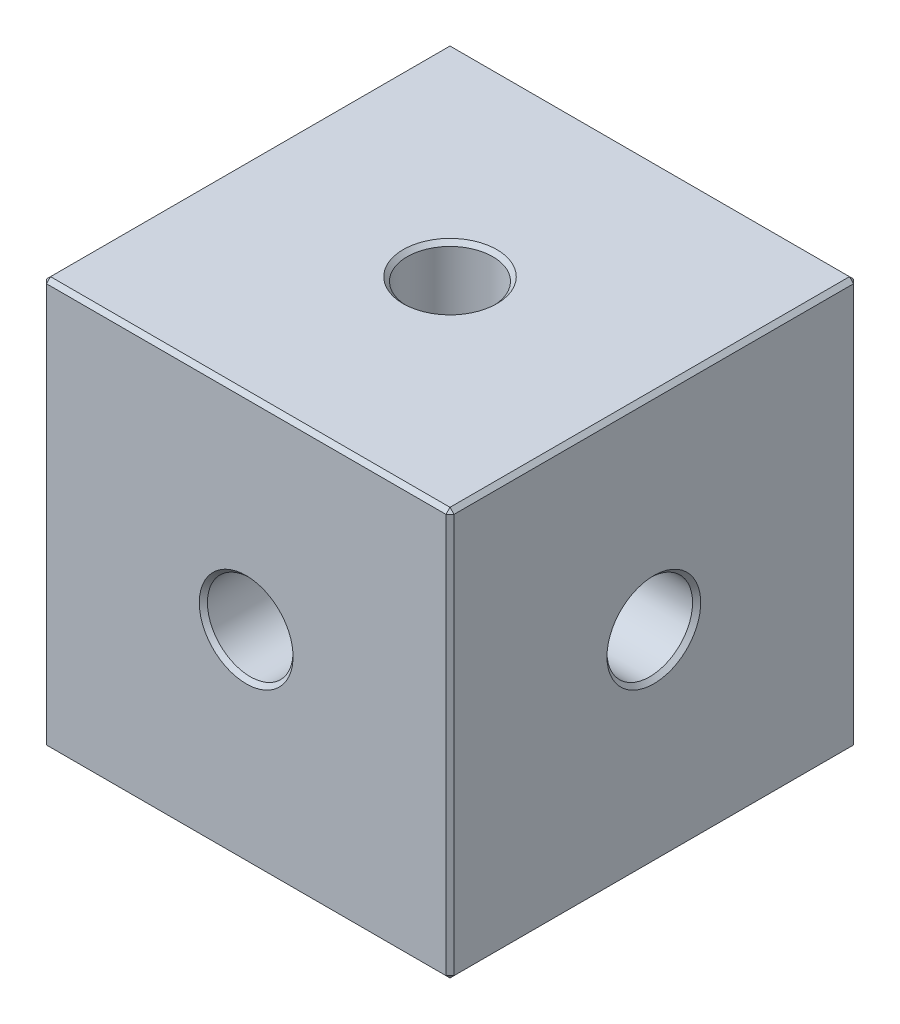
ISO-10303-21;
HEADER;
FILE_DESCRIPTION(('STEP AP214'),'2;1');
FILE_NAME('part.step','',(''),(''),'','','');
FILE_SCHEMA(('AUTOMOTIVE_DESIGN { 1 0 10303 214 1 1 1 1 }'));
ENDSEC;
DATA;
#1=APPLICATION_CONTEXT('core data for automotive mechanical design processes');
#2=APPLICATION_PROTOCOL_DEFINITION('international standard','automotive_design',2000,#1);
#3=PRODUCT_CONTEXT('',#1,'mechanical');
#4=PRODUCT('Part','Part','',(#3));
#5=PRODUCT_RELATED_PRODUCT_CATEGORY('part','',(#4));
#6=PRODUCT_DEFINITION_FORMATION('','',#4);
#7=PRODUCT_DEFINITION_CONTEXT('part definition',#1,'design');
#8=PRODUCT_DEFINITION('design','',#6,#7);
#9=PRODUCT_DEFINITION_SHAPE('','',#8);
#10=(LENGTH_UNIT() NAMED_UNIT(*) SI_UNIT(.MILLI.,.METRE.));
#11=(NAMED_UNIT(*) PLANE_ANGLE_UNIT() SI_UNIT($,.RADIAN.));
#12=(NAMED_UNIT(*) SI_UNIT($,.STERADIAN.) SOLID_ANGLE_UNIT());
#13=UNCERTAINTY_MEASURE_WITH_UNIT(LENGTH_MEASURE(1.E-05),#10,'distance_accuracy_value','');
#14=(GEOMETRIC_REPRESENTATION_CONTEXT(3) GLOBAL_UNCERTAINTY_ASSIGNED_CONTEXT((#13)) GLOBAL_UNIT_ASSIGNED_CONTEXT((#10,
#11,#12)) REPRESENTATION_CONTEXT('',''));
#15=CARTESIAN_POINT('',(0.,0.,0.));
#16=DIRECTION('',(0.,0.,1.));
#17=DIRECTION('',(1.,0.,0.));
#18=AXIS2_PLACEMENT_3D('',#15,#16,#17);
#19=CARTESIAN_POINT('',(10.,10.,-10.));
#20=DIRECTION('',(-1.,0.,0.));
#21=DIRECTION('',(0.,0.,1.));
#22=AXIS2_PLACEMENT_3D('',#19,#20,#21);
#23=PLANE('',#22);
#24=CARTESIAN_POINT('',(10.,0.,0.));
#25=DIRECTION('',(-1.,0.,0.));
#26=DIRECTION('',(0.,0.,1.));
#27=AXIS2_PLACEMENT_3D('',#24,#25,#26);
#28=CIRCLE('',#27,2.3);
#29=CARTESIAN_POINT('',(10.,0.,2.3));
#30=VERTEX_POINT('',#29);
#31=EDGE_CURVE('E248',#30,#30,#28,.T.);
#32=ORIENTED_EDGE('',*,*,#31,.T.);
#33=EDGE_LOOP('',(#32));
#34=FACE_BOUND('',#33,.T.);
#35=DIRECTION('',(0.,0.,-1.));
#36=VECTOR('',#35,1.);
#37=CARTESIAN_POINT('',(10.,-9.8,-10.));
#38=LINE('',#37,#36);
#39=CARTESIAN_POINT('',(10.,-9.8,9.8));
#40=VERTEX_POINT('',#39);
#41=CARTESIAN_POINT('',(10.,-9.8,-9.8));
#42=VERTEX_POINT('',#41);
#43=EDGE_CURVE('E243',#40,#42,#38,.T.);
#44=ORIENTED_EDGE('',*,*,#43,.T.);
#45=DIRECTION('',(0.,1.,0.));
#46=VECTOR('',#45,1.);
#47=CARTESIAN_POINT('',(10.,10.,-9.8));
#48=LINE('',#47,#46);
#49=CARTESIAN_POINT('',(10.,9.8,-9.8));
#50=VERTEX_POINT('',#49);
#51=EDGE_CURVE('E245',#42,#50,#48,.T.);
#52=ORIENTED_EDGE('',*,*,#51,.T.);
#53=DIRECTION('',(0.,0.,1.));
#54=VECTOR('',#53,1.);
#55=CARTESIAN_POINT('',(10.,9.8,10.));
#56=LINE('',#55,#54);
#57=CARTESIAN_POINT('',(10.,9.8,9.8));
#58=VERTEX_POINT('',#57);
#59=EDGE_CURVE('E239',#50,#58,#56,.T.);
#60=ORIENTED_EDGE('',*,*,#59,.T.);
#61=DIRECTION('',(0.,-1.,0.));
#62=VECTOR('',#61,1.);
#63=CARTESIAN_POINT('',(10.,10.,9.8));
#64=LINE('',#63,#62);
#65=EDGE_CURVE('E241',#58,#40,#64,.T.);
#66=ORIENTED_EDGE('',*,*,#65,.T.);
#67=EDGE_LOOP('',(#44,#52,#60,#66));
#68=FACE_BOUND('',#67,.T.);
#69=ADVANCED_FACE('F41',(#34,#68),#23,.F.);
#70=CARTESIAN_POINT('',(0.,0.,10.));
#71=DIRECTION('',(0.,0.,1.));
#72=DIRECTION('',(1.,0.,0.));
#73=AXIS2_PLACEMENT_3D('',#70,#71,#72);
#74=CYLINDRICAL_SURFACE('',#73,2.1);
#75=CARTESIAN_POINT('',(0.,0.,9.80000000000001));
#76=DIRECTION('',(0.,0.,-1.));
#77=DIRECTION('',(-1.,0.,0.));
#78=AXIS2_PLACEMENT_3D('',#75,#76,#77);
#79=CIRCLE('',#78,2.1);
#80=CARTESIAN_POINT('',(-2.1,0.,9.80000000000001));
#81=VERTEX_POINT('',#80);
#82=EDGE_CURVE('E251',#81,#81,#79,.F.);
#83=ORIENTED_EDGE('',*,*,#82,.T.);
#84=EDGE_LOOP('',(#83));
#85=FACE_BOUND('',#84,.T.);
#86=CARTESIAN_POINT('',(0.,0.,0.));
#87=DIRECTION('',(0.,0.707106781186547,0.707106781186547));
#88=DIRECTION('',(0.,-0.707106781186547,0.707106781186547));
#89=AXIS2_PLACEMENT_3D('',#86,#87,#88);
#90=ELLIPSE('',#89,2.9698484809835,2.1);
#91=CARTESIAN_POINT('',(1.48492424049175,-1.48492424049175,1.48492424049175));
#92=VERTEX_POINT('',#91);
#93=CARTESIAN_POINT('',(-1.48492424049175,-1.48492424049175,1.48492424049175));
#94=VERTEX_POINT('',#93);
#95=EDGE_CURVE('E167',#92,#94,#90,.F.);
#96=ORIENTED_EDGE('',*,*,#95,.T.);
#97=CARTESIAN_POINT('',(0.,0.,0.));
#98=DIRECTION('',(0.707106781186548,0.,0.707106781186547));
#99=DIRECTION('',(-0.707106781186547,0.,0.707106781186547));
#100=AXIS2_PLACEMENT_3D('',#97,#98,#99);
#101=ELLIPSE('',#100,2.9698484809835,2.1);
#102=CARTESIAN_POINT('',(-1.48492424049175,1.48492424049175,1.48492424049175));
#103=VERTEX_POINT('',#102);
#104=EDGE_CURVE('E161',#94,#103,#101,.F.);
#105=ORIENTED_EDGE('',*,*,#104,.T.);
#106=CARTESIAN_POINT('',(0.,0.,0.));
#107=DIRECTION('',(0.,-0.707106781186547,0.707106781186547));
#108=DIRECTION('',(0.,0.707106781186547,0.707106781186547));
#109=AXIS2_PLACEMENT_3D('',#106,#107,#108);
#110=ELLIPSE('',#109,2.9698484809835,2.1);
#111=CARTESIAN_POINT('',(1.48492424049175,1.48492424049175,1.48492424049175));
#112=VERTEX_POINT('',#111);
#113=EDGE_CURVE('E181',#103,#112,#110,.F.);
#114=ORIENTED_EDGE('',*,*,#113,.T.);
#115=CARTESIAN_POINT('',(0.,0.,0.));
#116=DIRECTION('',(-0.707106781186547,0.,0.707106781186547));
#117=DIRECTION('',(0.707106781186548,0.,0.707106781186547));
#118=AXIS2_PLACEMENT_3D('',#115,#116,#117);
#119=ELLIPSE('',#118,2.9698484809835,2.1);
#120=EDGE_CURVE('E185',#112,#92,#119,.F.);
#121=ORIENTED_EDGE('',*,*,#120,.T.);
#122=EDGE_LOOP('',(#96,#105,#114,#121));
#123=FACE_BOUND('',#122,.T.);
#124=ADVANCED_FACE('F400',(#85,#123),#74,.F.);
#125=CARTESIAN_POINT('',(-10.,10.,10.));
#126=DIRECTION('',(0.,0.,-1.));
#127=DIRECTION('',(-1.,0.,0.));
#128=AXIS2_PLACEMENT_3D('',#125,#126,#127);
#129=PLANE('',#128);
#130=CARTESIAN_POINT('',(0.,0.,10.));
#131=DIRECTION('',(0.,0.,-1.));
#132=DIRECTION('',(-1.,0.,0.));
#133=AXIS2_PLACEMENT_3D('',#130,#131,#132);
#134=CIRCLE('',#133,2.29999999999999);
#135=CARTESIAN_POINT('',(-2.29999999999999,0.,10.));
#136=VERTEX_POINT('',#135);
#137=EDGE_CURVE('E263',#136,#136,#134,.T.);
#138=ORIENTED_EDGE('',*,*,#137,.T.);
#139=EDGE_LOOP('',(#138));
#140=FACE_BOUND('',#139,.T.);
#141=DIRECTION('',(-1.,0.,0.));
#142=VECTOR('',#141,1.);
#143=CARTESIAN_POINT('',(-10.,9.8,10.));
#144=LINE('',#143,#142);
#145=CARTESIAN_POINT('',(9.80000000000001,9.8,10.));
#146=VERTEX_POINT('',#145);
#147=CARTESIAN_POINT('',(-9.8,9.8,10.));
#148=VERTEX_POINT('',#147);
#149=EDGE_CURVE('E254',#146,#148,#144,.T.);
#150=ORIENTED_EDGE('',*,*,#149,.T.);
#151=DIRECTION('',(0.,-1.,0.));
#152=VECTOR('',#151,1.);
#153=CARTESIAN_POINT('',(-9.8,10.,10.));
#154=LINE('',#153,#152);
#155=CARTESIAN_POINT('',(-9.8,-9.8,10.));
#156=VERTEX_POINT('',#155);
#157=EDGE_CURVE('E260',#148,#156,#154,.T.);
#158=ORIENTED_EDGE('',*,*,#157,.T.);
#159=DIRECTION('',(1.,0.,0.));
#160=VECTOR('',#159,1.);
#161=CARTESIAN_POINT('',(-10.,-9.8,10.));
#162=LINE('',#161,#160);
#163=CARTESIAN_POINT('',(9.80000000000001,-9.8,10.));
#164=VERTEX_POINT('',#163);
#165=EDGE_CURVE('E258',#156,#164,#162,.T.);
#166=ORIENTED_EDGE('',*,*,#165,.T.);
#167=DIRECTION('',(0.,1.,0.));
#168=VECTOR('',#167,1.);
#169=CARTESIAN_POINT('',(9.80000000000001,10.,10.));
#170=LINE('',#169,#168);
#171=EDGE_CURVE('E256',#164,#146,#170,.T.);
#172=ORIENTED_EDGE('',*,*,#171,.T.);
#173=EDGE_LOOP('',(#150,#158,#166,#172));
#174=FACE_BOUND('',#173,.T.);
#175=ADVANCED_FACE('F406',(#140,#174),#129,.F.);
#176=CARTESIAN_POINT('',(-10.,10.,-10.));
#177=DIRECTION('',(0.,0.,1.));
#178=DIRECTION('',(1.,0.,0.));
#179=AXIS2_PLACEMENT_3D('',#176,#177,#178);
#180=PLANE('',#179);
#181=CARTESIAN_POINT('',(0.,0.,-10.));
#182=DIRECTION('',(0.,0.,1.));
#183=DIRECTION('',(1.,0.,0.));
#184=AXIS2_PLACEMENT_3D('',#181,#182,#183);
#185=CIRCLE('',#184,2.29999999999999);
#186=CARTESIAN_POINT('',(2.29999999999999,0.,-10.));
#187=VERTEX_POINT('',#186);
#188=EDGE_CURVE('E230',#187,#187,#185,.T.);
#189=ORIENTED_EDGE('',*,*,#188,.T.);
#190=EDGE_LOOP('',(#189));
#191=FACE_BOUND('',#190,.T.);
#192=DIRECTION('',(-1.,0.,0.));
#193=VECTOR('',#192,1.);
#194=CARTESIAN_POINT('',(-10.,-9.8,-10.));
#195=LINE('',#194,#193);
#196=CARTESIAN_POINT('',(9.8,-9.8,-10.));
#197=VERTEX_POINT('',#196);
#198=CARTESIAN_POINT('',(-9.80000000000001,-9.8,-10.));
#199=VERTEX_POINT('',#198);
#200=EDGE_CURVE('E225',#197,#199,#195,.T.);
#201=ORIENTED_EDGE('',*,*,#200,.T.);
#202=DIRECTION('',(0.,1.,0.));
#203=VECTOR('',#202,1.);
#204=CARTESIAN_POINT('',(-9.80000000000001,10.,-10.));
#205=LINE('',#204,#203);
#206=CARTESIAN_POINT('',(-9.80000000000001,9.8,-10.));
#207=VERTEX_POINT('',#206);
#208=EDGE_CURVE('E227',#199,#207,#205,.T.);
#209=ORIENTED_EDGE('',*,*,#208,.T.);
#210=DIRECTION('',(1.,0.,0.));
#211=VECTOR('',#210,1.);
#212=CARTESIAN_POINT('',(10.,9.8,-10.));
#213=LINE('',#212,#211);
#214=CARTESIAN_POINT('',(9.8,9.8,-10.));
#215=VERTEX_POINT('',#214);
#216=EDGE_CURVE('E221',#207,#215,#213,.T.);
#217=ORIENTED_EDGE('',*,*,#216,.T.);
#218=DIRECTION('',(0.,-1.,0.));
#219=VECTOR('',#218,1.);
#220=CARTESIAN_POINT('',(9.8,10.,-10.));
#221=LINE('',#220,#219);
#222=EDGE_CURVE('E223',#215,#197,#221,.T.);
#223=ORIENTED_EDGE('',*,*,#222,.T.);
#224=EDGE_LOOP('',(#201,#209,#217,#223));
#225=FACE_BOUND('',#224,.T.);
#226=ADVANCED_FACE('F372',(#191,#225),#180,.F.);
#227=CARTESIAN_POINT('',(-10.,10.,-10.));
#228=DIRECTION('',(1.,0.,0.));
#229=DIRECTION('',(0.,0.,-1.));
#230=AXIS2_PLACEMENT_3D('',#227,#228,#229);
#231=PLANE('',#230);
#232=CARTESIAN_POINT('',(-10.,0.,0.));
#233=DIRECTION('',(1.,0.,0.));
#234=DIRECTION('',(0.,0.,-1.));
#235=AXIS2_PLACEMENT_3D('',#232,#233,#234);
#236=CIRCLE('',#235,2.29999999999998);
#237=CARTESIAN_POINT('',(-10.,0.,-2.29999999999998));
#238=VERTEX_POINT('',#237);
#239=EDGE_CURVE('E215',#238,#238,#236,.T.);
#240=ORIENTED_EDGE('',*,*,#239,.T.);
#241=EDGE_LOOP('',(#240));
#242=FACE_BOUND('',#241,.T.);
#243=DIRECTION('',(0.,-1.,0.));
#244=VECTOR('',#243,1.);
#245=CARTESIAN_POINT('',(-10.,10.,-9.8));
#246=LINE('',#245,#244);
#247=CARTESIAN_POINT('',(-10.,9.8,-9.8));
#248=VERTEX_POINT('',#247);
#249=CARTESIAN_POINT('',(-10.,-9.8,-9.8));
#250=VERTEX_POINT('',#249);
#251=EDGE_CURVE('E210',#248,#250,#246,.T.);
#252=ORIENTED_EDGE('',*,*,#251,.T.);
#253=DIRECTION('',(0.,0.,1.));
#254=VECTOR('',#253,1.);
#255=CARTESIAN_POINT('',(-10.,-9.8,-10.));
#256=LINE('',#255,#254);
#257=CARTESIAN_POINT('',(-10.,-9.8,9.8));
#258=VERTEX_POINT('',#257);
#259=EDGE_CURVE('E212',#250,#258,#256,.T.);
#260=ORIENTED_EDGE('',*,*,#259,.T.);
#261=DIRECTION('',(0.,1.,0.));
#262=VECTOR('',#261,1.);
#263=CARTESIAN_POINT('',(-10.,10.,9.8));
#264=LINE('',#263,#262);
#265=CARTESIAN_POINT('',(-10.,9.8,9.8));
#266=VERTEX_POINT('',#265);
#267=EDGE_CURVE('E208',#258,#266,#264,.T.);
#268=ORIENTED_EDGE('',*,*,#267,.T.);
#269=DIRECTION('',(0.,0.,-1.));
#270=VECTOR('',#269,1.);
#271=CARTESIAN_POINT('',(-10.,9.8,-10.));
#272=LINE('',#271,#270);
#273=EDGE_CURVE('E206',#266,#248,#272,.T.);
#274=ORIENTED_EDGE('',*,*,#273,.T.);
#275=EDGE_LOOP('',(#252,#260,#268,#274));
#276=FACE_BOUND('',#275,.T.);
#277=ADVANCED_FACE('F580',(#242,#276),#231,.F.);
#278=CARTESIAN_POINT('',(0.,10.,0.));
#279=DIRECTION('',(0.,1.,0.));
#280=DIRECTION('',(0.,0.,1.));
#281=AXIS2_PLACEMENT_3D('',#278,#279,#280);
#282=PLANE('',#281);
#283=DIRECTION('',(0.,0.,1.));
#284=VECTOR('',#283,1.);
#285=CARTESIAN_POINT('',(-9.8,10.,10.));
#286=LINE('',#285,#284);
#287=CARTESIAN_POINT('',(-9.80000000000001,10.,-9.8));
#288=VERTEX_POINT('',#287);
#289=CARTESIAN_POINT('',(-9.8,10.,9.80000000000001));
#290=VERTEX_POINT('',#289);
#291=EDGE_CURVE('E59',#288,#290,#286,.T.);
#292=ORIENTED_EDGE('',*,*,#291,.T.);
#293=DIRECTION('',(1.,0.,0.));
#294=VECTOR('',#293,1.);
#295=CARTESIAN_POINT('',(10.,10.,9.80000000000001));
#296=LINE('',#295,#294);
#297=CARTESIAN_POINT('',(9.80000000000001,10.,9.80000000000001));
#298=VERTEX_POINT('',#297);
#299=EDGE_CURVE('E51',#290,#298,#296,.T.);
#300=ORIENTED_EDGE('',*,*,#299,.T.);
#301=DIRECTION('',(0.,0.,-1.));
#302=VECTOR('',#301,1.);
#303=CARTESIAN_POINT('',(9.8,10.,-10.));
#304=LINE('',#303,#302);
#305=CARTESIAN_POINT('',(9.8,10.,-9.8));
#306=VERTEX_POINT('',#305);
#307=EDGE_CURVE('E269',#298,#306,#304,.T.);
#308=ORIENTED_EDGE('',*,*,#307,.T.);
#309=DIRECTION('',(-1.,0.,0.));
#310=VECTOR('',#309,1.);
#311=CARTESIAN_POINT('',(-10.,10.,-9.8));
#312=LINE('',#311,#310);
#313=EDGE_CURVE('E64',#306,#288,#312,.T.);
#314=ORIENTED_EDGE('',*,*,#313,.T.);
#315=EDGE_LOOP('',(#292,#300,#308,#314));
#316=FACE_BOUND('',#315,.T.);
#317=CARTESIAN_POINT('',(0.,10.,0.));
#318=DIRECTION('',(0.,1.,0.));
#319=DIRECTION('',(0.,0.,1.));
#320=AXIS2_PLACEMENT_3D('',#317,#318,#319);
#321=CIRCLE('',#320,2.29999999999999);
#322=CARTESIAN_POINT('',(0.,10.,2.29999999999999));
#323=VERTEX_POINT('',#322);
#324=EDGE_CURVE('E266',#323,#323,#321,.F.);
#325=ORIENTED_EDGE('',*,*,#324,.T.);
#326=EDGE_LOOP('',(#325));
#327=FACE_BOUND('',#326,.T.);
#328=ADVANCED_FACE('F583',(#316,#327),#282,.T.);
#329=CARTESIAN_POINT('',(0.,-10.,0.));
#330=DIRECTION('',(0.,1.,0.));
#331=DIRECTION('',(0.,0.,1.));
#332=AXIS2_PLACEMENT_3D('',#329,#330,#331);
#333=PLANE('',#332);
#334=CARTESIAN_POINT('',(0.,-10.,0.));
#335=DIRECTION('',(0.,1.,0.));
#336=DIRECTION('',(0.,0.,1.));
#337=AXIS2_PLACEMENT_3D('',#334,#335,#336);
#338=CIRCLE('',#337,2.3);
#339=CARTESIAN_POINT('',(0.,-10.,2.3));
#340=VERTEX_POINT('',#339);
#341=EDGE_CURVE('E200',#340,#340,#338,.T.);
#342=ORIENTED_EDGE('',*,*,#341,.T.);
#343=EDGE_LOOP('',(#342));
#344=FACE_BOUND('',#343,.T.);
#345=DIRECTION('',(-1.,0.,0.));
#346=VECTOR('',#345,1.);
#347=CARTESIAN_POINT('',(0.,-10.,9.80000000000001));
#348=LINE('',#347,#346);
#349=CARTESIAN_POINT('',(9.80000000000001,-10.,9.80000000000001));
#350=VERTEX_POINT('',#349);
#351=CARTESIAN_POINT('',(-9.8,-10.,9.80000000000001));
#352=VERTEX_POINT('',#351);
#353=EDGE_CURVE('E191',#350,#352,#348,.T.);
#354=ORIENTED_EDGE('',*,*,#353,.T.);
#355=DIRECTION('',(0.,0.,-1.));
#356=VECTOR('',#355,1.);
#357=CARTESIAN_POINT('',(-9.8,-10.,0.));
#358=LINE('',#357,#356);
#359=CARTESIAN_POINT('',(-9.80000000000001,-10.,-9.8));
#360=VERTEX_POINT('',#359);
#361=EDGE_CURVE('E197',#352,#360,#358,.T.);
#362=ORIENTED_EDGE('',*,*,#361,.T.);
#363=DIRECTION('',(1.,0.,0.));
#364=VECTOR('',#363,1.);
#365=CARTESIAN_POINT('',(0.,-10.,-9.8));
#366=LINE('',#365,#364);
#367=CARTESIAN_POINT('',(9.8,-10.,-9.8));
#368=VERTEX_POINT('',#367);
#369=EDGE_CURVE('E195',#360,#368,#366,.T.);
#370=ORIENTED_EDGE('',*,*,#369,.T.);
#371=DIRECTION('',(0.,0.,1.));
#372=VECTOR('',#371,1.);
#373=CARTESIAN_POINT('',(9.8,-10.,0.));
#374=LINE('',#373,#372);
#375=EDGE_CURVE('E193',#368,#350,#374,.T.);
#376=ORIENTED_EDGE('',*,*,#375,.T.);
#377=EDGE_LOOP('',(#354,#362,#370,#376));
#378=FACE_BOUND('',#377,.T.);
#379=ADVANCED_FACE('F571',(#344,#378),#333,.F.);
#380=CARTESIAN_POINT('',(0.,0.,-9.8));
#381=DIRECTION('',(0.,0.,1.));
#382=DIRECTION('',(1.,0.,0.));
#383=AXIS2_PLACEMENT_3D('',#380,#381,#382);
#384=CIRCLE('',#383,2.1);
#385=CARTESIAN_POINT('',(2.1,0.,-9.8));
#386=VERTEX_POINT('',#385);
#387=EDGE_CURVE('E233',#386,#386,#384,.F.);
#388=ORIENTED_EDGE('',*,*,#387,.T.);
#389=EDGE_LOOP('',(#388));
#390=FACE_BOUND('',#389,.T.);
#391=CARTESIAN_POINT('',(0.,0.,0.));
#392=DIRECTION('',(0.,-0.707106781186547,0.707106781186547));
#393=DIRECTION('',(0.,0.707106781186547,0.707106781186547));
#394=AXIS2_PLACEMENT_3D('',#391,#392,#393);
#395=ELLIPSE('',#394,2.9698484809835,2.1);
#396=CARTESIAN_POINT('',(-1.48492424049175,-1.48492424049175,-1.48492424049175));
#397=VERTEX_POINT('',#396);
#398=CARTESIAN_POINT('',(1.48492424049175,-1.48492424049175,-1.48492424049175));
#399=VERTEX_POINT('',#398);
#400=EDGE_CURVE('E174',#397,#399,#395,.T.);
#401=ORIENTED_EDGE('',*,*,#400,.T.);
#402=CARTESIAN_POINT('',(0.,0.,0.));
#403=DIRECTION('',(0.707106781186548,0.,0.707106781186547));
#404=DIRECTION('',(-0.707106781186547,0.,0.707106781186547));
#405=AXIS2_PLACEMENT_3D('',#402,#403,#404);
#406=ELLIPSE('',#405,2.9698484809835,2.1);
#407=CARTESIAN_POINT('',(1.48492424049175,1.48492424049175,-1.48492424049175));
#408=VERTEX_POINT('',#407);
#409=EDGE_CURVE('E603',#399,#408,#406,.T.);
#410=ORIENTED_EDGE('',*,*,#409,.T.);
#411=CARTESIAN_POINT('',(0.,0.,0.));
#412=DIRECTION('',(0.,0.707106781186547,0.707106781186547));
#413=DIRECTION('',(0.,-0.707106781186547,0.707106781186547));
#414=AXIS2_PLACEMENT_3D('',#411,#412,#413);
#415=ELLIPSE('',#414,2.9698484809835,2.1);
#416=CARTESIAN_POINT('',(-1.48492424049175,1.48492424049175,-1.48492424049175));
#417=VERTEX_POINT('',#416);
#418=EDGE_CURVE('E176',#408,#417,#415,.T.);
#419=ORIENTED_EDGE('',*,*,#418,.T.);
#420=CARTESIAN_POINT('',(0.,0.,0.));
#421=DIRECTION('',(-0.707106781186547,0.,0.707106781186547));
#422=DIRECTION('',(0.707106781186548,0.,0.707106781186547));
#423=AXIS2_PLACEMENT_3D('',#420,#421,#422);
#424=ELLIPSE('',#423,2.9698484809835,2.1);
#425=EDGE_CURVE('E158',#417,#397,#424,.T.);
#426=ORIENTED_EDGE('',*,*,#425,.T.);
#427=EDGE_LOOP('',(#401,#410,#419,#426));
#428=FACE_BOUND('',#427,.T.);
#429=ADVANCED_FACE('F172',(#390,#428),#74,.F.);
#430=CARTESIAN_POINT('',(0.,10.,0.));
#431=DIRECTION('',(0.,1.,0.));
#432=DIRECTION('',(0.,0.,1.));
#433=AXIS2_PLACEMENT_3D('',#430,#431,#432);
#434=CYLINDRICAL_SURFACE('',#433,2.1);
#435=CARTESIAN_POINT('',(0.,9.8,0.));
#436=DIRECTION('',(0.,1.,0.));
#437=DIRECTION('',(0.,0.,1.));
#438=AXIS2_PLACEMENT_3D('',#435,#436,#437);
#439=CIRCLE('',#438,2.1);
#440=CARTESIAN_POINT('',(0.,9.8,2.1));
#441=VERTEX_POINT('',#440);
#442=EDGE_CURVE('E11',#441,#441,#439,.T.);
#443=ORIENTED_EDGE('',*,*,#442,.T.);
#444=EDGE_LOOP('',(#443));
#445=FACE_BOUND('',#444,.T.);
#446=ORIENTED_EDGE('',*,*,#113,.F.);
#447=CARTESIAN_POINT('',(0.,0.,0.));
#448=DIRECTION('',(0.707106781186547,0.707106781186547,0.));
#449=DIRECTION('',(-0.707106781186547,0.707106781186547,0.));
#450=AXIS2_PLACEMENT_3D('',#447,#448,#449);
#451=ELLIPSE('',#450,2.9698484809835,2.1);
#452=EDGE_CURVE('E177',#103,#417,#451,.F.);
#453=ORIENTED_EDGE('',*,*,#452,.T.);
#454=ORIENTED_EDGE('',*,*,#418,.F.);
#455=CARTESIAN_POINT('',(0.,0.,0.));
#456=DIRECTION('',(-0.707106781186547,0.707106781186547,0.));
#457=DIRECTION('',(0.707106781186547,0.707106781186547,0.));
#458=AXIS2_PLACEMENT_3D('',#455,#456,#457);
#459=ELLIPSE('',#458,2.9698484809835,2.1);
#460=EDGE_CURVE('E599',#408,#112,#459,.F.);
#461=ORIENTED_EDGE('',*,*,#460,.T.);
#462=EDGE_LOOP('',(#446,#453,#454,#461));
#463=FACE_BOUND('',#462,.T.);
#464=ADVANCED_FACE('F593',(#445,#463),#434,.F.);
#465=CARTESIAN_POINT('',(0.,-9.8,0.));
#466=DIRECTION('',(0.,1.,0.));
#467=DIRECTION('',(0.,0.,1.));
#468=AXIS2_PLACEMENT_3D('',#465,#466,#467);
#469=CIRCLE('',#468,2.1);
#470=CARTESIAN_POINT('',(0.,-9.8,2.1));
#471=VERTEX_POINT('',#470);
#472=EDGE_CURVE('E203',#471,#471,#469,.F.);
#473=ORIENTED_EDGE('',*,*,#472,.T.);
#474=EDGE_LOOP('',(#473));
#475=FACE_BOUND('',#474,.T.);
#476=ORIENTED_EDGE('',*,*,#95,.F.);
#477=CARTESIAN_POINT('',(0.,0.,0.));
#478=DIRECTION('',(0.707106781186547,0.707106781186547,0.));
#479=DIRECTION('',(-0.707106781186547,0.707106781186547,0.));
#480=AXIS2_PLACEMENT_3D('',#477,#478,#479);
#481=ELLIPSE('',#480,2.9698484809835,2.1);
#482=EDGE_CURVE('E166',#92,#399,#481,.T.);
#483=ORIENTED_EDGE('',*,*,#482,.T.);
#484=ORIENTED_EDGE('',*,*,#400,.F.);
#485=CARTESIAN_POINT('',(0.,0.,0.));
#486=DIRECTION('',(-0.707106781186547,0.707106781186547,0.));
#487=DIRECTION('',(0.707106781186547,0.707106781186547,0.));
#488=AXIS2_PLACEMENT_3D('',#485,#486,#487);
#489=ELLIPSE('',#488,2.9698484809835,2.1);
#490=EDGE_CURVE('E155',#397,#94,#489,.T.);
#491=ORIENTED_EDGE('',*,*,#490,.T.);
#492=EDGE_LOOP('',(#476,#483,#484,#491));
#493=FACE_BOUND('',#492,.T.);
#494=ADVANCED_FACE('F180',(#475,#493),#434,.F.);
#495=CARTESIAN_POINT('',(10.,0.,0.));
#496=DIRECTION('',(1.,0.,0.));
#497=DIRECTION('',(0.,0.,-1.));
#498=AXIS2_PLACEMENT_3D('',#495,#496,#497);
#499=CYLINDRICAL_SURFACE('',#498,2.1);
#500=CARTESIAN_POINT('',(-9.80000000000001,0.,0.));
#501=DIRECTION('',(1.,0.,0.));
#502=DIRECTION('',(0.,0.,-1.));
#503=AXIS2_PLACEMENT_3D('',#500,#501,#502);
#504=CIRCLE('',#503,2.1);
#505=CARTESIAN_POINT('',(-9.80000000000001,0.,-2.1));
#506=VERTEX_POINT('',#505);
#507=EDGE_CURVE('E218',#506,#506,#504,.F.);
#508=ORIENTED_EDGE('',*,*,#507,.T.);
#509=EDGE_LOOP('',(#508));
#510=FACE_BOUND('',#509,.T.);
#511=ORIENTED_EDGE('',*,*,#490,.F.);
#512=ORIENTED_EDGE('',*,*,#425,.F.);
#513=ORIENTED_EDGE('',*,*,#452,.F.);
#514=ORIENTED_EDGE('',*,*,#104,.F.);
#515=EDGE_LOOP('',(#511,#512,#513,#514));
#516=FACE_BOUND('',#515,.T.);
#517=ADVANCED_FACE('F157',(#510,#516),#499,.F.);
#518=CARTESIAN_POINT('',(9.8,0.,0.));
#519=DIRECTION('',(-1.,0.,0.));
#520=DIRECTION('',(0.,0.,1.));
#521=AXIS2_PLACEMENT_3D('',#518,#519,#520);
#522=CIRCLE('',#521,2.1);
#523=CARTESIAN_POINT('',(9.8,0.,2.1));
#524=VERTEX_POINT('',#523);
#525=EDGE_CURVE('E236',#524,#524,#522,.F.);
#526=ORIENTED_EDGE('',*,*,#525,.T.);
#527=EDGE_LOOP('',(#526));
#528=FACE_BOUND('',#527,.T.);
#529=ORIENTED_EDGE('',*,*,#120,.F.);
#530=ORIENTED_EDGE('',*,*,#460,.F.);
#531=ORIENTED_EDGE('',*,*,#409,.F.);
#532=ORIENTED_EDGE('',*,*,#482,.F.);
#533=EDGE_LOOP('',(#529,#530,#531,#532));
#534=FACE_BOUND('',#533,.T.);
#535=ADVANCED_FACE('F420',(#528,#534),#499,.F.);
#536=CARTESIAN_POINT('',(0.,-10.,0.));
#537=DIRECTION('',(0.,-1.,0.));
#538=DIRECTION('',(0.,0.,-1.));
#539=AXIS2_PLACEMENT_3D('',#536,#537,#538);
#540=CONICAL_SURFACE('',#539,2.3,0.78539816339745);
#541=ORIENTED_EDGE('',*,*,#472,.F.);
#542=EDGE_LOOP('',(#541));
#543=FACE_BOUND('',#542,.T.);
#544=ORIENTED_EDGE('',*,*,#341,.F.);
#545=EDGE_LOOP('',(#544));
#546=FACE_BOUND('',#545,.T.);
#547=ADVANCED_FACE('F413',(#543,#546),#540,.F.);
#548=CARTESIAN_POINT('',(-10.,0.,0.));
#549=DIRECTION('',(-1.,0.,0.));
#550=DIRECTION('',(0.,0.,1.));
#551=AXIS2_PLACEMENT_3D('',#548,#549,#550);
#552=CONICAL_SURFACE('',#551,2.29999999999999,0.785398163397441);
#553=ORIENTED_EDGE('',*,*,#507,.F.);
#554=EDGE_LOOP('',(#553));
#555=FACE_BOUND('',#554,.T.);
#556=ORIENTED_EDGE('',*,*,#239,.F.);
#557=EDGE_LOOP('',(#556));
#558=FACE_BOUND('',#557,.T.);
#559=ADVANCED_FACE('F419',(#555,#558),#552,.F.);
#560=CARTESIAN_POINT('',(0.,0.,-10.));
#561=DIRECTION('',(0.,0.,-1.));
#562=DIRECTION('',(-1.,0.,0.));
#563=AXIS2_PLACEMENT_3D('',#560,#561,#562);
#564=CONICAL_SURFACE('',#563,2.29999999999999,0.785398163397433);
#565=ORIENTED_EDGE('',*,*,#387,.F.);
#566=EDGE_LOOP('',(#565));
#567=FACE_BOUND('',#566,.T.);
#568=ORIENTED_EDGE('',*,*,#188,.F.);
#569=EDGE_LOOP('',(#568));
#570=FACE_BOUND('',#569,.T.);
#571=ADVANCED_FACE('F427',(#567,#570),#564,.F.);
#572=CARTESIAN_POINT('',(9.8,0.,0.));
#573=DIRECTION('',(1.,0.,0.));
#574=DIRECTION('',(0.,0.,-1.));
#575=AXIS2_PLACEMENT_3D('',#572,#573,#574);
#576=CONICAL_SURFACE('',#575,2.1,0.785398163397458);
#577=ORIENTED_EDGE('',*,*,#31,.F.);
#578=EDGE_LOOP('',(#577));
#579=FACE_BOUND('',#578,.T.);
#580=ORIENTED_EDGE('',*,*,#525,.F.);
#581=EDGE_LOOP('',(#580));
#582=FACE_BOUND('',#581,.T.);
#583=ADVANCED_FACE('F434',(#579,#582),#576,.F.);
#584=CARTESIAN_POINT('',(0.,0.,9.80000000000001));
#585=DIRECTION('',(0.,0.,1.));
#586=DIRECTION('',(1.,0.,0.));
#587=AXIS2_PLACEMENT_3D('',#584,#585,#586);
#588=CONICAL_SURFACE('',#587,2.1,0.78539816339745);
#589=ORIENTED_EDGE('',*,*,#137,.F.);
#590=EDGE_LOOP('',(#589));
#591=FACE_BOUND('',#590,.T.);
#592=ORIENTED_EDGE('',*,*,#82,.F.);
#593=EDGE_LOOP('',(#592));
#594=FACE_BOUND('',#593,.T.);
#595=ADVANCED_FACE('F441',(#591,#594),#588,.F.);
#596=CARTESIAN_POINT('',(9.8,10.,0.));
#597=DIRECTION('',(0.707106781186547,0.707106781186547,0.));
#598=DIRECTION('',(0.,0.,1.));
#599=AXIS2_PLACEMENT_3D('',#596,#597,#598);
#600=PLANE('',#599);
#601=DIRECTION('',(0.707106781186547,-0.707106781186547,0.));
#602=VECTOR('',#601,1.);
#603=CARTESIAN_POINT('',(10.,9.8,-9.8));
#604=LINE('',#603,#602);
#605=EDGE_CURVE('E46',#306,#50,#604,.T.);
#606=ORIENTED_EDGE('',*,*,#605,.F.);
#607=ORIENTED_EDGE('',*,*,#307,.F.);
#608=DIRECTION('',(-0.707106781186548,0.707106781186548,0.));
#609=VECTOR('',#608,1.);
#610=CARTESIAN_POINT('',(9.9,9.9,9.80000000000001));
#611=LINE('',#610,#609);
#612=EDGE_CURVE('E333',#58,#298,#611,.T.);
#613=ORIENTED_EDGE('',*,*,#612,.F.);
#614=ORIENTED_EDGE('',*,*,#59,.F.);
#615=EDGE_LOOP('',(#606,#607,#613,#614));
#616=FACE_BOUND('',#615,.T.);
#617=ADVANCED_FACE('F349',(#616),#600,.T.);
#618=CARTESIAN_POINT('',(10.,9.8,-9.8));
#619=DIRECTION('',(0.577350269189626,0.577350269189626,-0.577350269189626));
#620=DIRECTION('',(-0.707106781186547,0.,-0.707106781186547));
#621=AXIS2_PLACEMENT_3D('',#618,#619,#620);
#622=PLANE('',#621);
#623=DIRECTION('',(0.,0.707106781186547,0.707106781186547));
#624=VECTOR('',#623,1.);
#625=CARTESIAN_POINT('',(9.8,9.9,-9.9));
#626=LINE('',#625,#624);
#627=EDGE_CURVE('E329',#306,#215,#626,.F.);
#628=ORIENTED_EDGE('',*,*,#627,.F.);
#629=ORIENTED_EDGE('',*,*,#605,.T.);
#630=DIRECTION('',(0.707106781186547,0.,0.707106781186547));
#631=VECTOR('',#630,1.);
#632=CARTESIAN_POINT('',(10.,9.8,-9.8));
#633=LINE('',#632,#631);
#634=EDGE_CURVE('E332',#215,#50,#633,.T.);
#635=ORIENTED_EDGE('',*,*,#634,.F.);
#636=EDGE_LOOP('',(#628,#629,#635));
#637=FACE_BOUND('',#636,.T.);
#638=ADVANCED_FACE('F346',(#637),#622,.T.);
#639=CARTESIAN_POINT('',(9.80000000000001,9.8,10.));
#640=DIRECTION('',(0.577350269189629,0.577350269189624,0.577350269189624));
#641=DIRECTION('',(0.707106781186544,0.,-0.707106781186551));
#642=AXIS2_PLACEMENT_3D('',#639,#640,#641);
#643=PLANE('',#642);
#644=DIRECTION('',(-0.707106781186544,0.,0.707106781186551));
#645=VECTOR('',#644,1.);
#646=CARTESIAN_POINT('',(9.80000000000001,9.8,10.));
#647=LINE('',#646,#645);
#648=EDGE_CURVE('E324',#58,#146,#647,.T.);
#649=ORIENTED_EDGE('',*,*,#648,.F.);
#650=ORIENTED_EDGE('',*,*,#612,.T.);
#651=DIRECTION('',(0.,-0.707106781186547,0.707106781186547));
#652=VECTOR('',#651,1.);
#653=CARTESIAN_POINT('',(9.80000000000001,9.8,10.));
#654=LINE('',#653,#652);
#655=EDGE_CURVE('E327',#146,#298,#654,.F.);
#656=ORIENTED_EDGE('',*,*,#655,.F.);
#657=EDGE_LOOP('',(#649,#650,#656));
#658=FACE_BOUND('',#657,.T.);
#659=ADVANCED_FACE('F396',(#658),#643,.T.);
#660=CARTESIAN_POINT('',(9.8,10.,-10.));
#661=DIRECTION('',(-0.707106781186547,0.,0.707106781186547));
#662=DIRECTION('',(0.,-1.,0.));
#663=AXIS2_PLACEMENT_3D('',#660,#661,#662);
#664=PLANE('',#663);
#665=ORIENTED_EDGE('',*,*,#634,.T.);
#666=ORIENTED_EDGE('',*,*,#51,.F.);
#667=DIRECTION('',(-0.707106781186547,0.,-0.707106781186547));
#668=VECTOR('',#667,1.);
#669=CARTESIAN_POINT('',(9.9,-9.8,-9.9));
#670=LINE('',#669,#668);
#671=EDGE_CURVE('E318',#197,#42,#670,.F.);
#672=ORIENTED_EDGE('',*,*,#671,.F.);
#673=ORIENTED_EDGE('',*,*,#222,.F.);
#674=EDGE_LOOP('',(#665,#666,#672,#673));
#675=FACE_BOUND('',#674,.T.);
#676=ADVANCED_FACE('F356',(#675),#664,.F.);
#677=CARTESIAN_POINT('',(0.,10.,-9.8));
#678=DIRECTION('',(0.,0.707106781186547,-0.707106781186547));
#679=DIRECTION('',(1.,0.,0.));
#680=AXIS2_PLACEMENT_3D('',#677,#678,#679);
#681=PLANE('',#680);
#682=ORIENTED_EDGE('',*,*,#627,.T.);
#683=ORIENTED_EDGE('',*,*,#216,.F.);
#684=DIRECTION('',(0.,-0.707106781186547,-0.707106781186547));
#685=VECTOR('',#684,1.);
#686=CARTESIAN_POINT('',(-9.80000000000001,9.8,-10.));
#687=LINE('',#686,#685);
#688=EDGE_CURVE('E315',#288,#207,#687,.T.);
#689=ORIENTED_EDGE('',*,*,#688,.F.);
#690=ORIENTED_EDGE('',*,*,#313,.F.);
#691=EDGE_LOOP('',(#682,#683,#689,#690));
#692=FACE_BOUND('',#691,.T.);
#693=ADVANCED_FACE('F385',(#692),#681,.T.);
#694=CARTESIAN_POINT('',(-9.8,10.,0.));
#695=DIRECTION('',(-0.707106781186547,0.707106781186547,0.));
#696=DIRECTION('',(0.,0.,-1.));
#697=AXIS2_PLACEMENT_3D('',#694,#695,#696);
#698=PLANE('',#697);
#699=DIRECTION('',(-0.707106781186547,-0.707106781186547,0.));
#700=VECTOR('',#699,1.);
#701=CARTESIAN_POINT('',(-10.,9.8,9.8));
#702=LINE('',#701,#700);
#703=EDGE_CURVE('E309',#290,#266,#702,.T.);
#704=ORIENTED_EDGE('',*,*,#703,.F.);
#705=ORIENTED_EDGE('',*,*,#291,.F.);
#706=DIRECTION('',(0.707106781186548,0.707106781186548,0.));
#707=VECTOR('',#706,1.);
#708=CARTESIAN_POINT('',(-9.9,9.9,-9.8));
#709=LINE('',#708,#707);
#710=EDGE_CURVE('E312',#248,#288,#709,.T.);
#711=ORIENTED_EDGE('',*,*,#710,.F.);
#712=ORIENTED_EDGE('',*,*,#273,.F.);
#713=EDGE_LOOP('',(#704,#705,#711,#712));
#714=FACE_BOUND('',#713,.T.);
#715=ADVANCED_FACE('F387',(#714),#698,.T.);
#716=CARTESIAN_POINT('',(0.,10.,9.80000000000001));
#717=DIRECTION('',(0.,0.707106781186547,0.707106781186547));
#718=DIRECTION('',(-1.,0.,0.));
#719=AXIS2_PLACEMENT_3D('',#716,#717,#718);
#720=PLANE('',#719);
#721=ORIENTED_EDGE('',*,*,#655,.T.);
#722=ORIENTED_EDGE('',*,*,#299,.F.);
#723=DIRECTION('',(0.,0.707106781186547,-0.707106781186547));
#724=VECTOR('',#723,1.);
#725=CARTESIAN_POINT('',(-9.8,9.9,9.9));
#726=LINE('',#725,#724);
#727=EDGE_CURVE('E306',#148,#290,#726,.T.);
#728=ORIENTED_EDGE('',*,*,#727,.F.);
#729=ORIENTED_EDGE('',*,*,#149,.F.);
#730=EDGE_LOOP('',(#721,#722,#728,#729));
#731=FACE_BOUND('',#730,.T.);
#732=ADVANCED_FACE('F393',(#731),#720,.T.);
#733=CARTESIAN_POINT('',(10.,10.,9.8));
#734=DIRECTION('',(-0.707106781186551,0.,-0.707106781186544));
#735=DIRECTION('',(0.,-1.,0.));
#736=AXIS2_PLACEMENT_3D('',#733,#734,#735);
#737=PLANE('',#736);
#738=ORIENTED_EDGE('',*,*,#648,.T.);
#739=ORIENTED_EDGE('',*,*,#171,.F.);
#740=DIRECTION('',(0.707106781186544,0.,-0.707106781186551));
#741=VECTOR('',#740,1.);
#742=CARTESIAN_POINT('',(9.9,-9.8,9.9));
#743=LINE('',#742,#741);
#744=EDGE_CURVE('E303',#40,#164,#743,.F.);
#745=ORIENTED_EDGE('',*,*,#744,.F.);
#746=ORIENTED_EDGE('',*,*,#65,.F.);
#747=EDGE_LOOP('',(#738,#739,#745,#746));
#748=FACE_BOUND('',#747,.T.);
#749=ADVANCED_FACE('F524',(#748),#737,.F.);
#750=CARTESIAN_POINT('',(10.,-9.8,-10.));
#751=DIRECTION('',(-0.707106781186547,0.707106781186547,0.));
#752=DIRECTION('',(0.,0.,-1.));
#753=AXIS2_PLACEMENT_3D('',#750,#751,#752);
#754=PLANE('',#753);
#755=DIRECTION('',(0.707106781186547,0.707106781186547,0.));
#756=VECTOR('',#755,1.);
#757=CARTESIAN_POINT('',(9.8,-10.,-9.8));
#758=LINE('',#757,#756);
#759=EDGE_CURVE('E321',#42,#368,#758,.F.);
#760=ORIENTED_EDGE('',*,*,#759,.F.);
#761=ORIENTED_EDGE('',*,*,#43,.F.);
#762=DIRECTION('',(-0.707106781186548,-0.707106781186548,0.));
#763=VECTOR('',#762,1.);
#764=CARTESIAN_POINT('',(9.80000000000001,-10.,9.80000000000001));
#765=LINE('',#764,#763);
#766=EDGE_CURVE('E300',#350,#40,#765,.F.);
#767=ORIENTED_EDGE('',*,*,#766,.F.);
#768=ORIENTED_EDGE('',*,*,#375,.F.);
#769=EDGE_LOOP('',(#760,#761,#767,#768));
#770=FACE_BOUND('',#769,.T.);
#771=ADVANCED_FACE('F360',(#770),#754,.F.);
#772=CARTESIAN_POINT('',(9.8,-10.,-9.8));
#773=DIRECTION('',(0.577350269189626,-0.577350269189626,-0.577350269189626));
#774=DIRECTION('',(-0.707106781186547,0.,-0.707106781186547));
#775=AXIS2_PLACEMENT_3D('',#772,#773,#774);
#776=PLANE('',#775);
#777=ORIENTED_EDGE('',*,*,#671,.T.);
#778=ORIENTED_EDGE('',*,*,#759,.T.);
#779=DIRECTION('',(0.,-0.707106781186547,0.707106781186547));
#780=VECTOR('',#779,1.);
#781=CARTESIAN_POINT('',(9.8,-10.,-9.8));
#782=LINE('',#781,#780);
#783=EDGE_CURVE('E297',#197,#368,#782,.T.);
#784=ORIENTED_EDGE('',*,*,#783,.F.);
#785=EDGE_LOOP('',(#777,#778,#784));
#786=FACE_BOUND('',#785,.T.);
#787=ADVANCED_FACE('F364',(#786),#776,.T.);
#788=CARTESIAN_POINT('',(-9.80000000000001,9.8,-10.));
#789=DIRECTION('',(-0.577350269189626,0.577350269189626,-0.577350269189626));
#790=DIRECTION('',(-0.707106781186547,0.,0.707106781186547));
#791=AXIS2_PLACEMENT_3D('',#788,#789,#790);
#792=PLANE('',#791);
#793=ORIENTED_EDGE('',*,*,#710,.T.);
#794=ORIENTED_EDGE('',*,*,#688,.T.);
#795=DIRECTION('',(0.707106781186547,0.,-0.707106781186547));
#796=VECTOR('',#795,1.);
#797=CARTESIAN_POINT('',(-9.80000000000001,9.8,-10.));
#798=LINE('',#797,#796);
#799=EDGE_CURVE('E295',#248,#207,#798,.T.);
#800=ORIENTED_EDGE('',*,*,#799,.F.);
#801=EDGE_LOOP('',(#793,#794,#800));
#802=FACE_BOUND('',#801,.T.);
#803=ADVANCED_FACE('F382',(#802),#792,.T.);
#804=CARTESIAN_POINT('',(-10.,9.8,9.8));
#805=DIRECTION('',(-0.577350269189629,0.577350269189624,0.577350269189624));
#806=DIRECTION('',(0.707106781186544,0.,0.707106781186551));
#807=AXIS2_PLACEMENT_3D('',#804,#805,#806);
#808=PLANE('',#807);
#809=ORIENTED_EDGE('',*,*,#727,.T.);
#810=ORIENTED_EDGE('',*,*,#703,.T.);
#811=DIRECTION('',(-0.707106781186544,0.,-0.707106781186551));
#812=VECTOR('',#811,1.);
#813=CARTESIAN_POINT('',(-10.,9.8,9.8));
#814=LINE('',#813,#812);
#815=EDGE_CURVE('E292',#148,#266,#814,.T.);
#816=ORIENTED_EDGE('',*,*,#815,.F.);
#817=EDGE_LOOP('',(#809,#810,#816));
#818=FACE_BOUND('',#817,.T.);
#819=ADVANCED_FACE('F501',(#818),#808,.T.);
#820=CARTESIAN_POINT('',(9.80000000000001,-10.,9.80000000000001));
#821=DIRECTION('',(0.577350269189629,-0.577350269189624,0.577350269189624));
#822=DIRECTION('',(0.707106781186544,0.,-0.707106781186551));
#823=AXIS2_PLACEMENT_3D('',#820,#821,#822);
#824=PLANE('',#823);
#825=ORIENTED_EDGE('',*,*,#766,.T.);
#826=ORIENTED_EDGE('',*,*,#744,.T.);
#827=DIRECTION('',(0.,0.707106781186547,0.707106781186547));
#828=VECTOR('',#827,1.);
#829=CARTESIAN_POINT('',(9.80000000000001,-10.,9.80000000000001));
#830=LINE('',#829,#828);
#831=EDGE_CURVE('E289',#350,#164,#830,.T.);
#832=ORIENTED_EDGE('',*,*,#831,.F.);
#833=EDGE_LOOP('',(#825,#826,#832));
#834=FACE_BOUND('',#833,.T.);
#835=ADVANCED_FACE('F495',(#834),#824,.T.);
#836=CARTESIAN_POINT('',(-10.,-9.8,-10.));
#837=DIRECTION('',(0.,0.707106781186547,0.707106781186547));
#838=DIRECTION('',(-1.,0.,0.));
#839=AXIS2_PLACEMENT_3D('',#836,#837,#838);
#840=PLANE('',#839);
#841=ORIENTED_EDGE('',*,*,#783,.T.);
#842=ORIENTED_EDGE('',*,*,#369,.F.);
#843=DIRECTION('',(0.,0.707106781186547,-0.707106781186547));
#844=VECTOR('',#843,1.);
#845=CARTESIAN_POINT('',(-9.80000000000001,-10.,-9.8));
#846=LINE('',#845,#844);
#847=EDGE_CURVE('E286',#199,#360,#846,.F.);
#848=ORIENTED_EDGE('',*,*,#847,.F.);
#849=ORIENTED_EDGE('',*,*,#200,.F.);
#850=EDGE_LOOP('',(#841,#842,#848,#849));
#851=FACE_BOUND('',#850,.T.);
#852=ADVANCED_FACE('F369',(#851),#840,.F.);
#853=CARTESIAN_POINT('',(-10.,10.,-9.8));
#854=DIRECTION('',(0.707106781186547,0.,0.707106781186547));
#855=DIRECTION('',(0.,-1.,0.));
#856=AXIS2_PLACEMENT_3D('',#853,#854,#855);
#857=PLANE('',#856);
#858=ORIENTED_EDGE('',*,*,#799,.T.);
#859=ORIENTED_EDGE('',*,*,#208,.F.);
#860=DIRECTION('',(-0.707106781186547,0.,0.707106781186547));
#861=VECTOR('',#860,1.);
#862=CARTESIAN_POINT('',(-9.9,-9.8,-9.9));
#863=LINE('',#862,#861);
#864=EDGE_CURVE('E283',#250,#199,#863,.F.);
#865=ORIENTED_EDGE('',*,*,#864,.F.);
#866=ORIENTED_EDGE('',*,*,#251,.F.);
#867=EDGE_LOOP('',(#858,#859,#865,#866));
#868=FACE_BOUND('',#867,.T.);
#869=ADVANCED_FACE('F375',(#868),#857,.F.);
#870=CARTESIAN_POINT('',(-9.8,10.,10.));
#871=DIRECTION('',(0.707106781186551,0.,-0.707106781186544));
#872=DIRECTION('',(0.,-1.,0.));
#873=AXIS2_PLACEMENT_3D('',#870,#871,#872);
#874=PLANE('',#873);
#875=ORIENTED_EDGE('',*,*,#815,.T.);
#876=ORIENTED_EDGE('',*,*,#267,.F.);
#877=DIRECTION('',(0.707106781186544,0.,0.707106781186551));
#878=VECTOR('',#877,1.);
#879=CARTESIAN_POINT('',(-10.,-9.8,9.8));
#880=LINE('',#879,#878);
#881=EDGE_CURVE('E280',#156,#258,#880,.F.);
#882=ORIENTED_EDGE('',*,*,#881,.F.);
#883=ORIENTED_EDGE('',*,*,#157,.F.);
#884=EDGE_LOOP('',(#875,#876,#882,#883));
#885=FACE_BOUND('',#884,.T.);
#886=ADVANCED_FACE('F477',(#885),#874,.F.);
#887=CARTESIAN_POINT('',(-10.,-9.8,10.));
#888=DIRECTION('',(0.,0.707106781186547,-0.707106781186547));
#889=DIRECTION('',(1.,0.,0.));
#890=AXIS2_PLACEMENT_3D('',#887,#888,#889);
#891=PLANE('',#890);
#892=ORIENTED_EDGE('',*,*,#831,.T.);
#893=ORIENTED_EDGE('',*,*,#165,.F.);
#894=DIRECTION('',(0.,-0.707106781186547,-0.707106781186547));
#895=VECTOR('',#894,1.);
#896=CARTESIAN_POINT('',(-9.8,-9.9,9.9));
#897=LINE('',#896,#895);
#898=EDGE_CURVE('E278',#352,#156,#897,.F.);
#899=ORIENTED_EDGE('',*,*,#898,.F.);
#900=ORIENTED_EDGE('',*,*,#353,.F.);
#901=EDGE_LOOP('',(#892,#893,#899,#900));
#902=FACE_BOUND('',#901,.T.);
#903=ADVANCED_FACE('F470',(#902),#891,.F.);
#904=CARTESIAN_POINT('',(-9.80000000000001,-10.,-9.8));
#905=DIRECTION('',(-0.577350269189626,-0.577350269189626,-0.577350269189626));
#906=DIRECTION('',(-0.707106781186547,0.,0.707106781186547));
#907=AXIS2_PLACEMENT_3D('',#904,#905,#906);
#908=PLANE('',#907);
#909=ORIENTED_EDGE('',*,*,#864,.T.);
#910=ORIENTED_EDGE('',*,*,#847,.T.);
#911=DIRECTION('',(0.707106781186548,-0.707106781186548,0.));
#912=VECTOR('',#911,1.);
#913=CARTESIAN_POINT('',(-9.80000000000001,-10.,-9.8));
#914=LINE('',#913,#912);
#915=EDGE_CURVE('E276',#250,#360,#914,.T.);
#916=ORIENTED_EDGE('',*,*,#915,.F.);
#917=EDGE_LOOP('',(#909,#910,#916));
#918=FACE_BOUND('',#917,.T.);
#919=ADVANCED_FACE('F463',(#918),#908,.T.);
#920=CARTESIAN_POINT('',(-10.,-9.8,9.8));
#921=DIRECTION('',(-0.577350269189629,-0.577350269189624,0.577350269189624));
#922=DIRECTION('',(0.707106781186544,0.,0.707106781186551));
#923=AXIS2_PLACEMENT_3D('',#920,#921,#922);
#924=PLANE('',#923);
#925=ORIENTED_EDGE('',*,*,#898,.T.);
#926=ORIENTED_EDGE('',*,*,#881,.T.);
#927=DIRECTION('',(-0.707106781186547,0.707106781186547,0.));
#928=VECTOR('',#927,1.);
#929=CARTESIAN_POINT('',(-10.,-9.8,9.8));
#930=LINE('',#929,#928);
#931=EDGE_CURVE('E274',#352,#258,#930,.T.);
#932=ORIENTED_EDGE('',*,*,#931,.F.);
#933=EDGE_LOOP('',(#925,#926,#932));
#934=FACE_BOUND('',#933,.T.);
#935=ADVANCED_FACE('F456',(#934),#924,.T.);
#936=CARTESIAN_POINT('',(-10.,-9.8,-10.));
#937=DIRECTION('',(0.707106781186547,0.707106781186547,0.));
#938=DIRECTION('',(0.,0.,1.));
#939=AXIS2_PLACEMENT_3D('',#936,#937,#938);
#940=PLANE('',#939);
#941=ORIENTED_EDGE('',*,*,#915,.T.);
#942=ORIENTED_EDGE('',*,*,#361,.F.);
#943=ORIENTED_EDGE('',*,*,#931,.T.);
#944=ORIENTED_EDGE('',*,*,#259,.F.);
#945=EDGE_LOOP('',(#941,#942,#943,#944));
#946=FACE_BOUND('',#945,.T.);
#947=ADVANCED_FACE('F450',(#946),#940,.F.);
#948=CARTESIAN_POINT('',(0.,9.8,0.));
#949=DIRECTION('',(0.,1.,0.));
#950=DIRECTION('',(0.,0.,1.));
#951=AXIS2_PLACEMENT_3D('',#948,#949,#950);
#952=CONICAL_SURFACE('',#951,2.1,0.78539816339745);
#953=ORIENTED_EDGE('',*,*,#324,.F.);
#954=EDGE_LOOP('',(#953));
#955=FACE_BOUND('',#954,.T.);
#956=ORIENTED_EDGE('',*,*,#442,.F.);
#957=EDGE_LOOP('',(#956));
#958=FACE_BOUND('',#957,.T.);
#959=ADVANCED_FACE('F44',(#955,#958),#952,.F.);
#960=CLOSED_SHELL('',(#69,#124,#175,#226,#277,#328,#379,#429,#464,#494,#517,#535,#547,#559,#571,
#583,#595,#617,#638,#659,#676,#693,#715,#732,#749,#771,#787,#803,#819,#835,#852,#869,#886,#903,
#919,#935,#947,#959));
#961=MANIFOLD_SOLID_BREP('B2',#960);
#962=ADVANCED_BREP_SHAPE_REPRESENTATION('',(#18,#961),#14);
#963=SHAPE_DEFINITION_REPRESENTATION(#9,#962);
ENDSEC;
END-ISO-10303-21;
